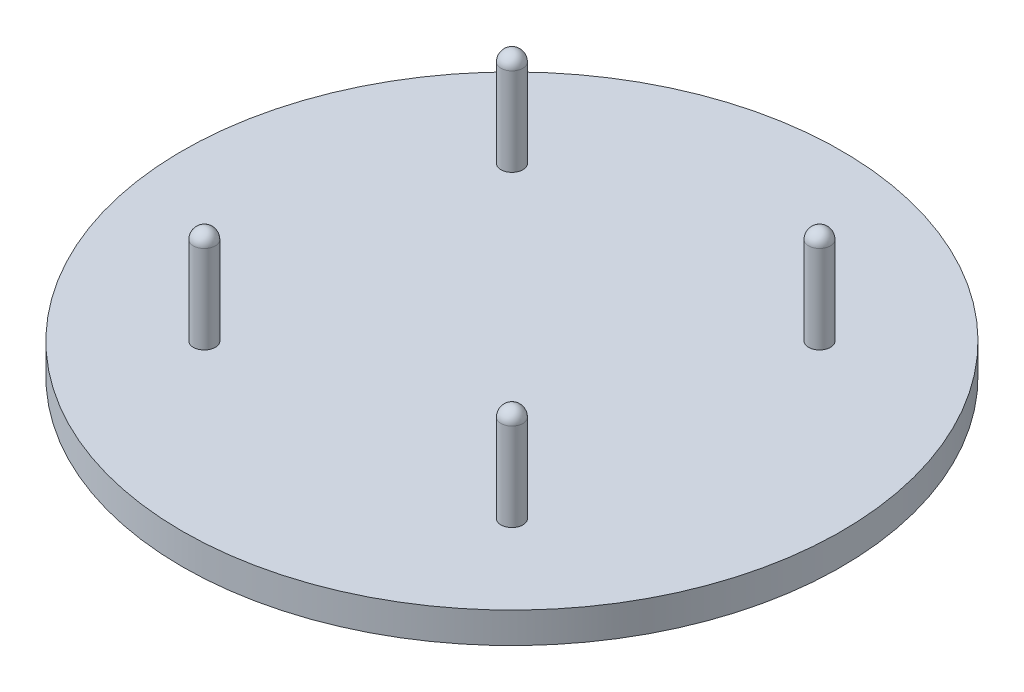
ISO-10303-21;
HEADER;
FILE_DESCRIPTION(('STEP AP214'),'2;1');
FILE_NAME('part.step','',(''),(''),'','','');
FILE_SCHEMA(('AUTOMOTIVE_DESIGN { 1 0 10303 214 1 1 1 1 }'));
ENDSEC;
DATA;
#1=APPLICATION_CONTEXT('core data for automotive mechanical design processes');
#2=APPLICATION_PROTOCOL_DEFINITION('international standard','automotive_design',2000,#1);
#3=PRODUCT_CONTEXT('',#1,'mechanical');
#4=PRODUCT('Part','Part','',(#3));
#5=PRODUCT_RELATED_PRODUCT_CATEGORY('part','',(#4));
#6=PRODUCT_DEFINITION_FORMATION('','',#4);
#7=PRODUCT_DEFINITION_CONTEXT('part definition',#1,'design');
#8=PRODUCT_DEFINITION('design','',#6,#7);
#9=PRODUCT_DEFINITION_SHAPE('','',#8);
#10=(LENGTH_UNIT() NAMED_UNIT(*) SI_UNIT(.MILLI.,.METRE.));
#11=(NAMED_UNIT(*) PLANE_ANGLE_UNIT() SI_UNIT($,.RADIAN.));
#12=(NAMED_UNIT(*) SI_UNIT($,.STERADIAN.) SOLID_ANGLE_UNIT());
#13=UNCERTAINTY_MEASURE_WITH_UNIT(LENGTH_MEASURE(1.E-05),#10,'distance_accuracy_value','');
#14=(GEOMETRIC_REPRESENTATION_CONTEXT(3) GLOBAL_UNCERTAINTY_ASSIGNED_CONTEXT((#13)) GLOBAL_UNIT_ASSIGNED_CONTEXT((#10,
#11,#12)) REPRESENTATION_CONTEXT('',''));
#15=CARTESIAN_POINT('',(0.,0.,0.));
#16=DIRECTION('',(0.,0.,1.));
#17=DIRECTION('',(1.,0.,0.));
#18=AXIS2_PLACEMENT_3D('',#15,#16,#17);
#19=CARTESIAN_POINT('',(0.,7.,0.));
#20=DIRECTION('',(0.,1.,0.));
#21=DIRECTION('',(0.,0.,1.));
#22=AXIS2_PLACEMENT_3D('',#19,#20,#21);
#23=PLANE('',#22);
#24=CARTESIAN_POINT('',(-35.0000000000001,7.,35.));
#25=DIRECTION('',(0.,1.,0.));
#26=DIRECTION('',(0.,0.,-1.));
#27=AXIS2_PLACEMENT_3D('',#24,#25,#26);
#28=CIRCLE('',#27,2.5);
#29=CARTESIAN_POINT('',(-35.0000000000001,7.,32.5));
#30=VERTEX_POINT('',#29);
#31=EDGE_CURVE('E61',#30,#30,#28,.T.);
#32=ORIENTED_EDGE('',*,*,#31,.F.);
#33=EDGE_LOOP('',(#32));
#34=FACE_BOUND('',#33,.T.);
#35=CARTESIAN_POINT('',(35.0000000000001,7.,-35.));
#36=DIRECTION('',(0.,1.,0.));
#37=DIRECTION('',(0.,0.,1.));
#38=AXIS2_PLACEMENT_3D('',#35,#36,#37);
#39=CIRCLE('',#38,2.5);
#40=CARTESIAN_POINT('',(35.0000000000001,7.,-32.5));
#41=VERTEX_POINT('',#40);
#42=EDGE_CURVE('E49',#41,#41,#39,.T.);
#43=ORIENTED_EDGE('',*,*,#42,.F.);
#44=EDGE_LOOP('',(#43));
#45=FACE_BOUND('',#44,.T.);
#46=CARTESIAN_POINT('',(0.,7.,0.));
#47=DIRECTION('',(0.,1.,0.));
#48=DIRECTION('',(0.,0.,1.));
#49=AXIS2_PLACEMENT_3D('',#46,#47,#48);
#50=CIRCLE('',#49,75.);
#51=CARTESIAN_POINT('',(0.,7.,75.));
#52=VERTEX_POINT('',#51);
#53=EDGE_CURVE('E10',#52,#52,#50,.T.);
#54=ORIENTED_EDGE('',*,*,#53,.T.);
#55=EDGE_LOOP('',(#54));
#56=FACE_BOUND('',#55,.T.);
#57=CARTESIAN_POINT('',(34.9999999999999,7.,35.0000000000002));
#58=DIRECTION('',(0.,1.,0.));
#59=DIRECTION('',(-1.,0.,0.));
#60=AXIS2_PLACEMENT_3D('',#57,#58,#59);
#61=CIRCLE('',#60,2.5);
#62=CARTESIAN_POINT('',(32.4999999999999,7.,35.0000000000002));
#63=VERTEX_POINT('',#62);
#64=EDGE_CURVE('E55',#63,#63,#61,.T.);
#65=ORIENTED_EDGE('',*,*,#64,.F.);
#66=EDGE_LOOP('',(#65));
#67=FACE_BOUND('',#66,.T.);
#68=CARTESIAN_POINT('',(-34.9999999999996,7.,-35.0000000000005));
#69=DIRECTION('',(0.,1.,0.));
#70=DIRECTION('',(1.,0.,0.));
#71=AXIS2_PLACEMENT_3D('',#68,#69,#70);
#72=CIRCLE('',#71,2.5);
#73=CARTESIAN_POINT('',(-32.4999999999996,7.,-35.0000000000005));
#74=VERTEX_POINT('',#73);
#75=EDGE_CURVE('E66',#74,#74,#72,.T.);
#76=ORIENTED_EDGE('',*,*,#75,.F.);
#77=EDGE_LOOP('',(#76));
#78=FACE_BOUND('',#77,.T.);
#79=ADVANCED_FACE('F34',(#34,#45,#56,#67,#78),#23,.T.);
#80=CARTESIAN_POINT('',(0.,7.,0.));
#81=DIRECTION('',(0.,-1.,0.));
#82=DIRECTION('',(0.,0.,-1.));
#83=AXIS2_PLACEMENT_3D('',#80,#81,#82);
#84=CYLINDRICAL_SURFACE('',#83,75.);
#85=ORIENTED_EDGE('',*,*,#53,.F.);
#86=EDGE_LOOP('',(#85));
#87=FACE_BOUND('',#86,.T.);
#88=CARTESIAN_POINT('',(0.,0.,0.));
#89=DIRECTION('',(0.,1.,0.));
#90=DIRECTION('',(0.,0.,1.));
#91=AXIS2_PLACEMENT_3D('',#88,#89,#90);
#92=CIRCLE('',#91,75.);
#93=CARTESIAN_POINT('',(0.,0.,75.));
#94=VERTEX_POINT('',#93);
#95=EDGE_CURVE('E42',#94,#94,#92,.T.);
#96=ORIENTED_EDGE('',*,*,#95,.T.);
#97=EDGE_LOOP('',(#96));
#98=FACE_BOUND('',#97,.T.);
#99=ADVANCED_FACE('F88',(#87,#98),#84,.T.);
#100=CARTESIAN_POINT('',(0.,0.,0.));
#101=DIRECTION('',(0.,1.,0.));
#102=DIRECTION('',(0.,0.,1.));
#103=AXIS2_PLACEMENT_3D('',#100,#101,#102);
#104=PLANE('',#103);
#105=ORIENTED_EDGE('',*,*,#95,.F.);
#106=EDGE_LOOP('',(#105));
#107=FACE_BOUND('',#106,.T.);
#108=ADVANCED_FACE('F94',(#107),#104,.F.);
#109=CARTESIAN_POINT('',(35.0000000000001,27.,-35.));
#110=DIRECTION('',(0.,-1.,0.));
#111=DIRECTION('',(0.,0.,-1.));
#112=AXIS2_PLACEMENT_3D('',#109,#110,#111);
#113=CYLINDRICAL_SURFACE('',#112,2.5);
#114=CARTESIAN_POINT('',(35.0000000000001,27.,-35.));
#115=DIRECTION('',(0.,1.,0.));
#116=DIRECTION('',(0.,0.,1.));
#117=AXIS2_PLACEMENT_3D('',#114,#115,#116);
#118=CIRCLE('',#117,2.5);
#119=CARTESIAN_POINT('',(35.0000000000001,27.,-32.5));
#120=VERTEX_POINT('',#119);
#121=EDGE_CURVE('E47',#120,#120,#118,.T.);
#122=ORIENTED_EDGE('',*,*,#121,.F.);
#123=EDGE_LOOP('',(#122));
#124=FACE_BOUND('',#123,.T.);
#125=ORIENTED_EDGE('',*,*,#42,.T.);
#126=EDGE_LOOP('',(#125));
#127=FACE_BOUND('',#126,.T.);
#128=ADVANCED_FACE('F100',(#124,#127),#113,.T.);
#129=CARTESIAN_POINT('',(34.9999999999999,27.,35.0000000000002));
#130=DIRECTION('',(0.,-1.,0.));
#131=DIRECTION('',(0.,0.,-1.));
#132=AXIS2_PLACEMENT_3D('',#129,#130,#131);
#133=CYLINDRICAL_SURFACE('',#132,2.5);
#134=CARTESIAN_POINT('',(34.9999999999999,27.,35.0000000000002));
#135=DIRECTION('',(0.,1.,0.));
#136=DIRECTION('',(-1.,0.,0.));
#137=AXIS2_PLACEMENT_3D('',#134,#135,#136);
#138=CIRCLE('',#137,2.5);
#139=CARTESIAN_POINT('',(32.4999999999999,27.,35.0000000000002));
#140=VERTEX_POINT('',#139);
#141=EDGE_CURVE('E52',#140,#140,#138,.T.);
#142=ORIENTED_EDGE('',*,*,#141,.F.);
#143=EDGE_LOOP('',(#142));
#144=FACE_BOUND('',#143,.T.);
#145=ORIENTED_EDGE('',*,*,#64,.T.);
#146=EDGE_LOOP('',(#145));
#147=FACE_BOUND('',#146,.T.);
#148=ADVANCED_FACE('F83',(#144,#147),#133,.T.);
#149=CARTESIAN_POINT('',(-35.0000000000001,27.,35.));
#150=DIRECTION('',(0.,-1.,0.));
#151=DIRECTION('',(0.,0.,-1.));
#152=AXIS2_PLACEMENT_3D('',#149,#150,#151);
#153=CYLINDRICAL_SURFACE('',#152,2.5);
#154=CARTESIAN_POINT('',(-35.0000000000001,27.,35.));
#155=DIRECTION('',(0.,1.,0.));
#156=DIRECTION('',(0.,0.,-1.));
#157=AXIS2_PLACEMENT_3D('',#154,#155,#156);
#158=CIRCLE('',#157,2.5);
#159=CARTESIAN_POINT('',(-35.0000000000001,27.,32.5));
#160=VERTEX_POINT('',#159);
#161=EDGE_CURVE('E58',#160,#160,#158,.T.);
#162=ORIENTED_EDGE('',*,*,#161,.F.);
#163=EDGE_LOOP('',(#162));
#164=FACE_BOUND('',#163,.T.);
#165=ORIENTED_EDGE('',*,*,#31,.T.);
#166=EDGE_LOOP('',(#165));
#167=FACE_BOUND('',#166,.T.);
#168=ADVANCED_FACE('F76',(#164,#167),#153,.T.);
#169=CARTESIAN_POINT('',(-34.9999999999996,27.,-35.0000000000005));
#170=DIRECTION('',(0.,-1.,0.));
#171=DIRECTION('',(0.,0.,-1.));
#172=AXIS2_PLACEMENT_3D('',#169,#170,#171);
#173=CYLINDRICAL_SURFACE('',#172,2.5);
#174=CARTESIAN_POINT('',(-34.9999999999996,27.,-35.0000000000005));
#175=DIRECTION('',(0.,1.,0.));
#176=DIRECTION('',(1.,0.,0.));
#177=AXIS2_PLACEMENT_3D('',#174,#175,#176);
#178=CIRCLE('',#177,2.5);
#179=CARTESIAN_POINT('',(-32.4999999999996,27.,-35.0000000000005));
#180=VERTEX_POINT('',#179);
#181=EDGE_CURVE('E38',#180,#180,#178,.T.);
#182=ORIENTED_EDGE('',*,*,#181,.F.);
#183=EDGE_LOOP('',(#182));
#184=FACE_BOUND('',#183,.T.);
#185=ORIENTED_EDGE('',*,*,#75,.T.);
#186=EDGE_LOOP('',(#185));
#187=FACE_BOUND('',#186,.T.);
#188=ADVANCED_FACE('F74',(#184,#187),#173,.T.);
#189=CARTESIAN_POINT('',(-34.9999999999996,27.,-35.0000000000005));
#190=DIRECTION('',(0.,0.,1.));
#191=DIRECTION('',(1.,0.,0.));
#192=AXIS2_PLACEMENT_3D('',#189,#190,#191);
#193=SPHERICAL_SURFACE('',#192,2.5);
#194=CARTESIAN_POINT('',(-34.9999999999996,27.,-35.0000000000005));
#195=DIRECTION('',(0.,1.,0.));
#196=DIRECTION('',(1.,0.,0.));
#197=AXIS2_PLACEMENT_3D('',#194,#195,#196);
#198=SPHERICAL_SURFACE('',#197,2.5);
#199=ORIENTED_EDGE('',*,*,#181,.T.);
#200=EDGE_LOOP('',(#199));
#201=FACE_BOUND('',#200,.T.);
#202=ADVANCED_FACE('F36',(#201),#198,.T.);
#203=CARTESIAN_POINT('',(35.0000000000006,27.,-34.9999999999995));
#204=DIRECTION('',(-1.,0.,0.));
#205=DIRECTION('',(0.,0.,1.));
#206=AXIS2_PLACEMENT_3D('',#203,#204,#205);
#207=SPHERICAL_SURFACE('',#206,2.5);
#208=CARTESIAN_POINT('',(35.0000000000006,27.,-34.9999999999995));
#209=DIRECTION('',(0.,1.,0.));
#210=DIRECTION('',(0.,0.,1.));
#211=AXIS2_PLACEMENT_3D('',#208,#209,#210);
#212=SPHERICAL_SURFACE('',#211,2.5);
#213=ORIENTED_EDGE('',*,*,#121,.T.);
#214=EDGE_LOOP('',(#213));
#215=FACE_BOUND('',#214,.T.);
#216=ADVANCED_FACE('F82',(#215),#212,.T.);
#217=CARTESIAN_POINT('',(34.9999999999996,27.,35.0000000000005));
#218=DIRECTION('',(0.,0.,-1.));
#219=DIRECTION('',(-1.,0.,0.));
#220=AXIS2_PLACEMENT_3D('',#217,#218,#219);
#221=SPHERICAL_SURFACE('',#220,2.5);
#222=CARTESIAN_POINT('',(34.9999999999996,27.,35.0000000000005));
#223=DIRECTION('',(0.,1.,0.));
#224=DIRECTION('',(-1.,0.,0.));
#225=AXIS2_PLACEMENT_3D('',#222,#223,#224);
#226=SPHERICAL_SURFACE('',#225,2.5);
#227=ORIENTED_EDGE('',*,*,#141,.T.);
#228=EDGE_LOOP('',(#227));
#229=FACE_BOUND('',#228,.T.);
#230=ADVANCED_FACE('F123',(#229),#226,.T.);
#231=CARTESIAN_POINT('',(-35.0000000000009,27.,34.9999999999993));
#232=DIRECTION('',(1.,0.,0.));
#233=DIRECTION('',(0.,0.,-1.));
#234=AXIS2_PLACEMENT_3D('',#231,#232,#233);
#235=SPHERICAL_SURFACE('',#234,2.5);
#236=CARTESIAN_POINT('',(-35.0000000000009,27.,34.9999999999993));
#237=DIRECTION('',(0.,1.,0.));
#238=DIRECTION('',(0.,0.,-1.));
#239=AXIS2_PLACEMENT_3D('',#236,#237,#238);
#240=SPHERICAL_SURFACE('',#239,2.5);
#241=ORIENTED_EDGE('',*,*,#161,.T.);
#242=EDGE_LOOP('',(#241));
#243=FACE_BOUND('',#242,.T.);
#244=ADVANCED_FACE('F127',(#243),#240,.T.);
#245=CLOSED_SHELL('',(#79,#99,#108,#128,#148,#168,#188,#202,#216,#230,#244));
#246=MANIFOLD_SOLID_BREP('B2',#245);
#247=ADVANCED_BREP_SHAPE_REPRESENTATION('',(#18,#246),#14);
#248=SHAPE_DEFINITION_REPRESENTATION(#9,#247);
ENDSEC;
END-ISO-10303-21;
